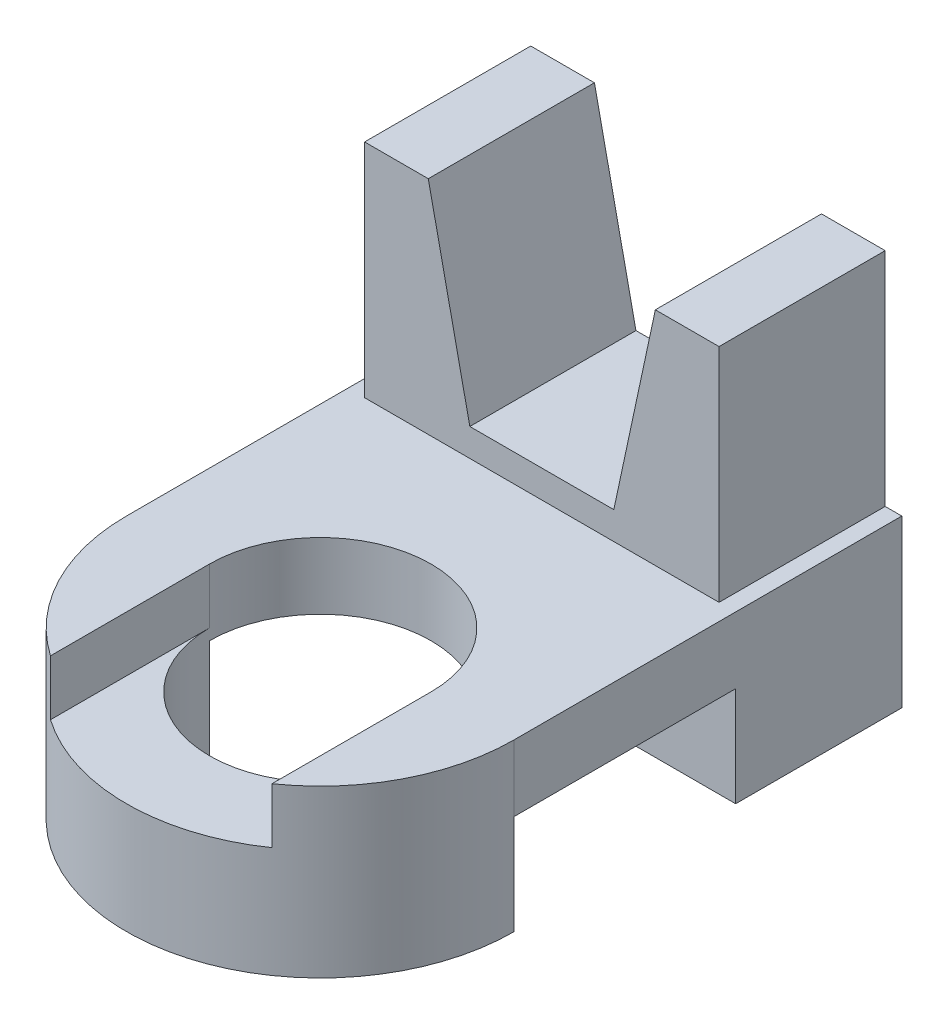
ISO-10303-21;
HEADER;
FILE_DESCRIPTION(('STEP AP214'),'2;1');
FILE_NAME('part.step','',(''),(''),'','','');
FILE_SCHEMA(('AUTOMOTIVE_DESIGN { 1 0 10303 214 1 1 1 1 }'));
ENDSEC;
DATA;
#1=APPLICATION_CONTEXT('core data for automotive mechanical design processes');
#2=APPLICATION_PROTOCOL_DEFINITION('international standard','automotive_design',2000,#1);
#3=PRODUCT_CONTEXT('',#1,'mechanical');
#4=PRODUCT('Part','Part','',(#3));
#5=PRODUCT_RELATED_PRODUCT_CATEGORY('part','',(#4));
#6=PRODUCT_DEFINITION_FORMATION('','',#4);
#7=PRODUCT_DEFINITION_CONTEXT('part definition',#1,'design');
#8=PRODUCT_DEFINITION('design','',#6,#7);
#9=PRODUCT_DEFINITION_SHAPE('','',#8);
#10=(LENGTH_UNIT() NAMED_UNIT(*) SI_UNIT(.MILLI.,.METRE.));
#11=(NAMED_UNIT(*) PLANE_ANGLE_UNIT() SI_UNIT($,.RADIAN.));
#12=(NAMED_UNIT(*) SI_UNIT($,.STERADIAN.) SOLID_ANGLE_UNIT());
#13=UNCERTAINTY_MEASURE_WITH_UNIT(LENGTH_MEASURE(1.E-05),#10,'distance_accuracy_value','');
#14=(GEOMETRIC_REPRESENTATION_CONTEXT(3) GLOBAL_UNCERTAINTY_ASSIGNED_CONTEXT((#13)) GLOBAL_UNIT_ASSIGNED_CONTEXT((#10,
#11,#12)) REPRESENTATION_CONTEXT('',''));
#15=CARTESIAN_POINT('',(0.,0.,0.));
#16=DIRECTION('',(0.,0.,1.));
#17=DIRECTION('',(1.,0.,0.));
#18=AXIS2_PLACEMENT_3D('',#15,#16,#17);
#19=CARTESIAN_POINT('',(0.,70.,0.));
#20=DIRECTION('',(0.,1.,0.));
#21=DIRECTION('',(0.,0.,1.));
#22=AXIS2_PLACEMENT_3D('',#19,#20,#21);
#23=PLANE('',#22);
#24=DIRECTION('',(0.,0.,1.));
#25=VECTOR('',#24,1.);
#26=CARTESIAN_POINT('',(20.5,70.,-35.));
#27=LINE('',#26,#25);
#28=CARTESIAN_POINT('',(20.5,70.,-35.));
#29=VERTEX_POINT('',#28);
#30=CARTESIAN_POINT('',(20.5,70.,-5.));
#31=VERTEX_POINT('',#30);
#32=EDGE_CURVE('E193',#29,#31,#27,.T.);
#33=ORIENTED_EDGE('',*,*,#32,.T.);
#34=DIRECTION('',(1.,0.,0.));
#35=VECTOR('',#34,1.);
#36=CARTESIAN_POINT('',(-32.,70.,-4.99999999999999));
#37=LINE('',#36,#35);
#38=CARTESIAN_POINT('',(32.,70.,-5.));
#39=VERTEX_POINT('',#38);
#40=EDGE_CURVE('E467',#31,#39,#37,.T.);
#41=ORIENTED_EDGE('',*,*,#40,.T.);
#42=DIRECTION('',(0.,0.,-1.));
#43=VECTOR('',#42,1.);
#44=CARTESIAN_POINT('',(32.,70.,-35.));
#45=LINE('',#44,#43);
#46=CARTESIAN_POINT('',(32.,70.,-35.));
#47=VERTEX_POINT('',#46);
#48=EDGE_CURVE('E217',#39,#47,#45,.T.);
#49=ORIENTED_EDGE('',*,*,#48,.T.);
#50=DIRECTION('',(-1.,0.,0.));
#51=VECTOR('',#50,1.);
#52=CARTESIAN_POINT('',(-32.,70.,-35.));
#53=LINE('',#52,#51);
#54=EDGE_CURVE('E211',#47,#29,#53,.T.);
#55=ORIENTED_EDGE('',*,*,#54,.T.);
#56=EDGE_LOOP('',(#33,#41,#49,#55));
#57=FACE_BOUND('',#56,.T.);
#58=ADVANCED_FACE('F49',(#57),#23,.T.);
#59=CARTESIAN_POINT('',(0.,0.,0.));
#60=DIRECTION('',(0.,1.,0.));
#61=DIRECTION('',(0.,0.,1.));
#62=AXIS2_PLACEMENT_3D('',#59,#60,#61);
#63=PLANE('',#62);
#64=CARTESIAN_POINT('',(0.,0.,35.));
#65=DIRECTION('',(0.,1.,0.));
#66=DIRECTION('',(0.,0.,1.));
#67=AXIS2_PLACEMENT_3D('',#64,#65,#66);
#68=CIRCLE('',#67,35.);
#69=CARTESIAN_POINT('',(-35.,0.,35.));
#70=VERTEX_POINT('',#69);
#71=CARTESIAN_POINT('',(35.,0.,35.));
#72=VERTEX_POINT('',#71);
#73=EDGE_CURVE('E357',#70,#72,#68,.T.);
#74=ORIENTED_EDGE('',*,*,#73,.F.);
#75=DIRECTION('',(1.,0.,0.));
#76=VECTOR('',#75,1.);
#77=CARTESIAN_POINT('',(-35.,0.,35.));
#78=LINE('',#77,#76);
#79=CARTESIAN_POINT('',(-20.,0.,35.));
#80=VERTEX_POINT('',#79);
#81=EDGE_CURVE('E296',#70,#80,#78,.T.);
#82=ORIENTED_EDGE('',*,*,#81,.T.);
#83=CARTESIAN_POINT('',(0.,0.,35.));
#84=DIRECTION('',(0.,1.,0.));
#85=DIRECTION('',(0.,0.,1.));
#86=AXIS2_PLACEMENT_3D('',#83,#84,#85);
#87=CIRCLE('',#86,20.);
#88=CARTESIAN_POINT('',(20.,0.,35.));
#89=VERTEX_POINT('',#88);
#90=EDGE_CURVE('E326',#80,#89,#87,.T.);
#91=ORIENTED_EDGE('',*,*,#90,.T.);
#92=DIRECTION('',(1.,0.,0.));
#93=VECTOR('',#92,1.);
#94=CARTESIAN_POINT('',(0.,0.,35.));
#95=LINE('',#94,#93);
#96=EDGE_CURVE('E382',#89,#72,#95,.T.);
#97=ORIENTED_EDGE('',*,*,#96,.T.);
#98=EDGE_LOOP('',(#74,#82,#91,#97));
#99=FACE_BOUND('',#98,.T.);
#100=ADVANCED_FACE('F427',(#99),#63,.F.);
#101=CARTESIAN_POINT('',(-35.,30.,0.));
#102=DIRECTION('',(-1.,0.,0.));
#103=DIRECTION('',(0.,0.,1.));
#104=AXIS2_PLACEMENT_3D('',#101,#102,#103);
#105=PLANE('',#104);
#106=DIRECTION('',(0.,0.,1.));
#107=VECTOR('',#106,1.);
#108=CARTESIAN_POINT('',(-35.,18.,35.));
#109=LINE('',#108,#107);
#110=CARTESIAN_POINT('',(-35.,18.,-4.99999999999998));
#111=VERTEX_POINT('',#110);
#112=CARTESIAN_POINT('',(-35.,18.,35.));
#113=VERTEX_POINT('',#112);
#114=EDGE_CURVE('E292',#111,#113,#109,.T.);
#115=ORIENTED_EDGE('',*,*,#114,.T.);
#116=DIRECTION('',(0.,-1.,0.));
#117=VECTOR('',#116,1.);
#118=CARTESIAN_POINT('',(-35.,30.,35.));
#119=LINE('',#118,#117);
#120=CARTESIAN_POINT('',(-35.,30.,35.));
#121=VERTEX_POINT('',#120);
#122=EDGE_CURVE('E378',#121,#113,#119,.T.);
#123=ORIENTED_EDGE('',*,*,#122,.F.);
#124=DIRECTION('',(0.,0.,-1.));
#125=VECTOR('',#124,1.);
#126=CARTESIAN_POINT('',(-35.,30.,0.));
#127=LINE('',#126,#125);
#128=CARTESIAN_POINT('',(-35.,30.,-35.));
#129=VERTEX_POINT('',#128);
#130=EDGE_CURVE('E331',#121,#129,#127,.T.);
#131=ORIENTED_EDGE('',*,*,#130,.T.);
#132=DIRECTION('',(0.,-1.,0.));
#133=VECTOR('',#132,1.);
#134=CARTESIAN_POINT('',(-35.,30.,-35.));
#135=LINE('',#134,#133);
#136=CARTESIAN_POINT('',(-35.,0.,-35.));
#137=VERTEX_POINT('',#136);
#138=EDGE_CURVE('E350',#129,#137,#135,.T.);
#139=ORIENTED_EDGE('',*,*,#138,.T.);
#140=DIRECTION('',(0.,0.,-1.));
#141=VECTOR('',#140,1.);
#142=CARTESIAN_POINT('',(-35.,0.,0.));
#143=LINE('',#142,#141);
#144=CARTESIAN_POINT('',(-35.,0.,-4.99999999999998));
#145=VERTEX_POINT('',#144);
#146=EDGE_CURVE('E354',#145,#137,#143,.T.);
#147=ORIENTED_EDGE('',*,*,#146,.F.);
#148=DIRECTION('',(0.,1.,0.));
#149=VECTOR('',#148,1.);
#150=CARTESIAN_POINT('',(-35.,0.,-4.99999999999998));
#151=LINE('',#150,#149);
#152=EDGE_CURVE('E287',#145,#111,#151,.T.);
#153=ORIENTED_EDGE('',*,*,#152,.T.);
#154=EDGE_LOOP('',(#115,#123,#131,#139,#147,#153));
#155=FACE_BOUND('',#154,.T.);
#156=ADVANCED_FACE('F435',(#155),#105,.T.);
#157=CARTESIAN_POINT('',(0.,30.,35.));
#158=DIRECTION('',(0.,-1.,0.));
#159=DIRECTION('',(0.,0.,-1.));
#160=AXIS2_PLACEMENT_3D('',#157,#158,#159);
#161=CYLINDRICAL_SURFACE('',#160,35.);
#162=CARTESIAN_POINT('',(0.,30.,35.));
#163=DIRECTION('',(0.,1.,0.));
#164=DIRECTION('',(0.,0.,1.));
#165=AXIS2_PLACEMENT_3D('',#162,#163,#164);
#166=CIRCLE('',#165,35.);
#167=CARTESIAN_POINT('',(20.,30.,63.7228132326902));
#168=VERTEX_POINT('',#167);
#169=CARTESIAN_POINT('',(35.,30.,35.));
#170=VERTEX_POINT('',#169);
#171=EDGE_CURVE('E336',#168,#170,#166,.T.);
#172=ORIENTED_EDGE('',*,*,#171,.F.);
#173=DIRECTION('',(0.,-1.,0.));
#174=VECTOR('',#173,1.);
#175=CARTESIAN_POINT('',(20.,30.,63.7228132326902));
#176=LINE('',#175,#174);
#177=CARTESIAN_POINT('',(20.,20.,63.7228132326902));
#178=VERTEX_POINT('',#177);
#179=EDGE_CURVE('E275',#168,#178,#176,.T.);
#180=ORIENTED_EDGE('',*,*,#179,.T.);
#181=CARTESIAN_POINT('',(0.,20.,35.));
#182=DIRECTION('',(0.,1.,0.));
#183=DIRECTION('',(0.,0.,1.));
#184=AXIS2_PLACEMENT_3D('',#181,#182,#183);
#185=CIRCLE('',#184,35.);
#186=CARTESIAN_POINT('',(-20.,20.,63.7228132326902));
#187=VERTEX_POINT('',#186);
#188=EDGE_CURVE('E279',#187,#178,#185,.T.);
#189=ORIENTED_EDGE('',*,*,#188,.F.);
#190=DIRECTION('',(0.,-1.,0.));
#191=VECTOR('',#190,1.);
#192=CARTESIAN_POINT('',(-20.,30.,63.7228132326902));
#193=LINE('',#192,#191);
#194=CARTESIAN_POINT('',(-20.,30.,63.7228132326902));
#195=VERTEX_POINT('',#194);
#196=EDGE_CURVE('E269',#187,#195,#193,.F.);
#197=ORIENTED_EDGE('',*,*,#196,.T.);
#198=EDGE_CURVE('E337',#121,#195,#166,.T.);
#199=ORIENTED_EDGE('',*,*,#198,.F.);
#200=ORIENTED_EDGE('',*,*,#122,.T.);
#201=DIRECTION('',(0.,-1.,0.));
#202=VECTOR('',#201,1.);
#203=CARTESIAN_POINT('',(-35.,0.,35.));
#204=LINE('',#203,#202);
#205=EDGE_CURVE('E283',#113,#70,#204,.T.);
#206=ORIENTED_EDGE('',*,*,#205,.T.);
#207=ORIENTED_EDGE('',*,*,#73,.T.);
#208=DIRECTION('',(0.,-1.,0.));
#209=VECTOR('',#208,1.);
#210=CARTESIAN_POINT('',(35.,0.,35.));
#211=LINE('',#210,#209);
#212=CARTESIAN_POINT('',(35.,18.,35.));
#213=VERTEX_POINT('',#212);
#214=EDGE_CURVE('E282',#213,#72,#211,.T.);
#215=ORIENTED_EDGE('',*,*,#214,.F.);
#216=DIRECTION('',(0.,-1.,0.));
#217=VECTOR('',#216,1.);
#218=CARTESIAN_POINT('',(35.,30.,35.));
#219=LINE('',#218,#217);
#220=EDGE_CURVE('E374',#170,#213,#219,.T.);
#221=ORIENTED_EDGE('',*,*,#220,.F.);
#222=EDGE_LOOP('',(#172,#180,#189,#197,#199,#200,#206,#207,#215,#221));
#223=FACE_BOUND('',#222,.T.);
#224=ADVANCED_FACE('F410',(#223),#161,.T.);
#225=CARTESIAN_POINT('',(35.,30.,0.));
#226=DIRECTION('',(-1.,0.,0.));
#227=DIRECTION('',(0.,0.,1.));
#228=AXIS2_PLACEMENT_3D('',#225,#226,#227);
#229=PLANE('',#228);
#230=ORIENTED_EDGE('',*,*,#220,.T.);
#231=DIRECTION('',(0.,0.,1.));
#232=VECTOR('',#231,1.);
#233=CARTESIAN_POINT('',(35.,18.,35.));
#234=LINE('',#233,#232);
#235=CARTESIAN_POINT('',(35.,18.,-4.99999999999999));
#236=VERTEX_POINT('',#235);
#237=EDGE_CURVE('E288',#236,#213,#234,.T.);
#238=ORIENTED_EDGE('',*,*,#237,.F.);
#239=DIRECTION('',(0.,1.,0.));
#240=VECTOR('',#239,1.);
#241=CARTESIAN_POINT('',(35.,0.,-4.99999999999999));
#242=LINE('',#241,#240);
#243=CARTESIAN_POINT('',(35.,0.,-4.99999999999999));
#244=VERTEX_POINT('',#243);
#245=EDGE_CURVE('E299',#244,#236,#242,.T.);
#246=ORIENTED_EDGE('',*,*,#245,.F.);
#247=DIRECTION('',(0.,0.,-1.));
#248=VECTOR('',#247,1.);
#249=CARTESIAN_POINT('',(35.,0.,0.));
#250=LINE('',#249,#248);
#251=CARTESIAN_POINT('',(35.,0.,-35.));
#252=VERTEX_POINT('',#251);
#253=EDGE_CURVE('E361',#244,#252,#250,.T.);
#254=ORIENTED_EDGE('',*,*,#253,.T.);
#255=DIRECTION('',(0.,-1.,0.));
#256=VECTOR('',#255,1.);
#257=CARTESIAN_POINT('',(35.,30.,-35.));
#258=LINE('',#257,#256);
#259=CARTESIAN_POINT('',(35.,30.,-35.));
#260=VERTEX_POINT('',#259);
#261=EDGE_CURVE('E370',#260,#252,#258,.T.);
#262=ORIENTED_EDGE('',*,*,#261,.F.);
#263=DIRECTION('',(0.,0.,-1.));
#264=VECTOR('',#263,1.);
#265=CARTESIAN_POINT('',(35.,30.,0.));
#266=LINE('',#265,#264);
#267=EDGE_CURVE('E341',#170,#260,#266,.T.);
#268=ORIENTED_EDGE('',*,*,#267,.F.);
#269=EDGE_LOOP('',(#230,#238,#246,#254,#262,#268));
#270=FACE_BOUND('',#269,.T.);
#271=ADVANCED_FACE('F576',(#270),#229,.F.);
#272=CARTESIAN_POINT('',(0.,30.,35.));
#273=DIRECTION('',(0.,-1.,0.));
#274=DIRECTION('',(0.,0.,-1.));
#275=AXIS2_PLACEMENT_3D('',#272,#273,#274);
#276=CYLINDRICAL_SURFACE('',#275,20.);
#277=DIRECTION('',(0.,1.,0.));
#278=VECTOR('',#277,1.);
#279=CARTESIAN_POINT('',(20.,20.,35.));
#280=LINE('',#279,#278);
#281=CARTESIAN_POINT('',(20.,20.,35.));
#282=VERTEX_POINT('',#281);
#283=CARTESIAN_POINT('',(20.,30.,35.));
#284=VERTEX_POINT('',#283);
#285=EDGE_CURVE('E265',#282,#284,#280,.T.);
#286=ORIENTED_EDGE('',*,*,#285,.T.);
#287=CARTESIAN_POINT('',(0.,30.,35.));
#288=DIRECTION('',(0.,1.,0.));
#289=DIRECTION('',(0.,0.,1.));
#290=AXIS2_PLACEMENT_3D('',#287,#288,#289);
#291=CIRCLE('',#290,20.);
#292=CARTESIAN_POINT('',(-20.,30.,35.));
#293=VERTEX_POINT('',#292);
#294=EDGE_CURVE('E327',#284,#293,#291,.T.);
#295=ORIENTED_EDGE('',*,*,#294,.T.);
#296=DIRECTION('',(0.,1.,0.));
#297=VECTOR('',#296,1.);
#298=CARTESIAN_POINT('',(-20.,20.,35.));
#299=LINE('',#298,#297);
#300=CARTESIAN_POINT('',(-20.,20.,35.));
#301=VERTEX_POINT('',#300);
#302=EDGE_CURVE('E262',#301,#293,#299,.T.);
#303=ORIENTED_EDGE('',*,*,#302,.F.);
#304=CARTESIAN_POINT('',(0.,20.,35.));
#305=DIRECTION('',(0.,1.,0.));
#306=DIRECTION('',(0.,0.,1.));
#307=AXIS2_PLACEMENT_3D('',#304,#305,#306);
#308=CIRCLE('',#307,20.);
#309=EDGE_CURVE('E11',#301,#282,#308,.T.);
#310=ORIENTED_EDGE('',*,*,#309,.T.);
#311=EDGE_LOOP('',(#286,#295,#303,#310));
#312=FACE_BOUND('',#311,.T.);
#313=DIRECTION('',(0.,-1.,0.));
#314=VECTOR('',#313,1.);
#315=CARTESIAN_POINT('',(-20.,30.,35.));
#316=LINE('',#315,#314);
#317=CARTESIAN_POINT('',(-20.,18.,35.));
#318=VERTEX_POINT('',#317);
#319=EDGE_CURVE('E323',#318,#80,#316,.T.);
#320=ORIENTED_EDGE('',*,*,#319,.F.);
#321=CARTESIAN_POINT('',(0.,18.,35.));
#322=DIRECTION('',(0.,1.,0.));
#323=DIRECTION('',(0.,0.,1.));
#324=AXIS2_PLACEMENT_3D('',#321,#322,#323);
#325=CIRCLE('',#324,20.);
#326=CARTESIAN_POINT('',(20.,18.,35.));
#327=VERTEX_POINT('',#326);
#328=EDGE_CURVE('E386',#327,#318,#325,.T.);
#329=ORIENTED_EDGE('',*,*,#328,.F.);
#330=DIRECTION('',(0.,-1.,0.));
#331=VECTOR('',#330,1.);
#332=CARTESIAN_POINT('',(20.,30.,35.));
#333=LINE('',#332,#331);
#334=EDGE_CURVE('E310',#89,#327,#333,.F.);
#335=ORIENTED_EDGE('',*,*,#334,.F.);
#336=ORIENTED_EDGE('',*,*,#90,.F.);
#337=EDGE_LOOP('',(#320,#329,#335,#336));
#338=FACE_BOUND('',#337,.T.);
#339=ADVANCED_FACE('F51',(#312,#338),#276,.F.);
#340=CARTESIAN_POINT('',(0.,30.,-35.));
#341=DIRECTION('',(0.,0.,-1.));
#342=DIRECTION('',(-1.,0.,0.));
#343=AXIS2_PLACEMENT_3D('',#340,#341,#342);
#344=PLANE('',#343);
#345=DIRECTION('',(0.209529088730873,0.97780241407741,0.));
#346=VECTOR('',#345,1.);
#347=CARTESIAN_POINT('',(13.,35.,-35.));
#348=LINE('',#347,#346);
#349=CARTESIAN_POINT('',(13.,35.,-35.));
#350=VERTEX_POINT('',#349);
#351=EDGE_CURVE('E196',#350,#29,#348,.T.);
#352=ORIENTED_EDGE('',*,*,#351,.T.);
#353=ORIENTED_EDGE('',*,*,#54,.F.);
#354=DIRECTION('',(0.,-1.,0.));
#355=VECTOR('',#354,1.);
#356=CARTESIAN_POINT('',(32.,70.,-35.));
#357=LINE('',#356,#355);
#358=CARTESIAN_POINT('',(32.,30.,-35.));
#359=VERTEX_POINT('',#358);
#360=EDGE_CURVE('E228',#47,#359,#357,.T.);
#361=ORIENTED_EDGE('',*,*,#360,.T.);
#362=DIRECTION('',(1.,0.,0.));
#363=VECTOR('',#362,1.);
#364=CARTESIAN_POINT('',(0.,30.,-35.));
#365=LINE('',#364,#363);
#366=EDGE_CURVE('E345',#359,#260,#365,.T.);
#367=ORIENTED_EDGE('',*,*,#366,.T.);
#368=ORIENTED_EDGE('',*,*,#261,.T.);
#369=DIRECTION('',(1.,0.,0.));
#370=VECTOR('',#369,1.);
#371=CARTESIAN_POINT('',(0.,0.,-35.));
#372=LINE('',#371,#370);
#373=EDGE_CURVE('E332',#137,#252,#372,.T.);
#374=ORIENTED_EDGE('',*,*,#373,.F.);
#375=ORIENTED_EDGE('',*,*,#138,.F.);
#376=CARTESIAN_POINT('',(-32.,30.,-35.));
#377=VERTEX_POINT('',#376);
#378=EDGE_CURVE('E346',#129,#377,#365,.T.);
#379=ORIENTED_EDGE('',*,*,#378,.T.);
#380=DIRECTION('',(0.,-1.,0.));
#381=VECTOR('',#380,1.);
#382=CARTESIAN_POINT('',(-32.,70.,-35.));
#383=LINE('',#382,#381);
#384=CARTESIAN_POINT('',(-32.,70.,-35.));
#385=VERTEX_POINT('',#384);
#386=EDGE_CURVE('E220',#385,#377,#383,.T.);
#387=ORIENTED_EDGE('',*,*,#386,.F.);
#388=CARTESIAN_POINT('',(-20.5,70.,-35.));
#389=VERTEX_POINT('',#388);
#390=EDGE_CURVE('E221',#389,#385,#53,.T.);
#391=ORIENTED_EDGE('',*,*,#390,.F.);
#392=DIRECTION('',(0.209529088730874,-0.97780241407741,0.));
#393=VECTOR('',#392,1.);
#394=CARTESIAN_POINT('',(-13.,35.,-35.));
#395=LINE('',#394,#393);
#396=CARTESIAN_POINT('',(-13.,35.,-35.));
#397=VERTEX_POINT('',#396);
#398=EDGE_CURVE('E65',#389,#397,#395,.T.);
#399=ORIENTED_EDGE('',*,*,#398,.T.);
#400=DIRECTION('',(1.,0.,0.));
#401=VECTOR('',#400,1.);
#402=CARTESIAN_POINT('',(-13.,35.,-35.));
#403=LINE('',#402,#401);
#404=EDGE_CURVE('E205',#397,#350,#403,.T.);
#405=ORIENTED_EDGE('',*,*,#404,.T.);
#406=EDGE_LOOP('',(#352,#353,#361,#367,#368,#374,#375,#379,#387,#391,#399,#405));
#407=FACE_BOUND('',#406,.T.);
#408=ADVANCED_FACE('F209',(#407),#344,.T.);
#409=CARTESIAN_POINT('',(0.,30.,0.));
#410=DIRECTION('',(0.,1.,0.));
#411=DIRECTION('',(0.,0.,1.));
#412=AXIS2_PLACEMENT_3D('',#409,#410,#411);
#413=PLANE('',#412);
#414=DIRECTION('',(0.,0.,1.));
#415=VECTOR('',#414,1.);
#416=CARTESIAN_POINT('',(-32.,30.,-35.));
#417=LINE('',#416,#415);
#418=CARTESIAN_POINT('',(-32.,30.,-4.99999999999999));
#419=VERTEX_POINT('',#418);
#420=EDGE_CURVE('E233',#377,#419,#417,.T.);
#421=ORIENTED_EDGE('',*,*,#420,.F.);
#422=ORIENTED_EDGE('',*,*,#378,.F.);
#423=ORIENTED_EDGE('',*,*,#130,.F.);
#424=ORIENTED_EDGE('',*,*,#198,.T.);
#425=DIRECTION('',(0.,0.,1.));
#426=VECTOR('',#425,1.);
#427=CARTESIAN_POINT('',(-20.,30.,35.));
#428=LINE('',#427,#426);
#429=EDGE_CURVE('E254',#293,#195,#428,.T.);
#430=ORIENTED_EDGE('',*,*,#429,.F.);
#431=ORIENTED_EDGE('',*,*,#294,.F.);
#432=DIRECTION('',(0.,0.,-1.));
#433=VECTOR('',#432,1.);
#434=CARTESIAN_POINT('',(20.,30.,0.));
#435=LINE('',#434,#433);
#436=EDGE_CURVE('E58',#168,#284,#435,.T.);
#437=ORIENTED_EDGE('',*,*,#436,.F.);
#438=ORIENTED_EDGE('',*,*,#171,.T.);
#439=ORIENTED_EDGE('',*,*,#267,.T.);
#440=ORIENTED_EDGE('',*,*,#366,.F.);
#441=DIRECTION('',(0.,0.,-1.));
#442=VECTOR('',#441,1.);
#443=CARTESIAN_POINT('',(32.,30.,-35.));
#444=LINE('',#443,#442);
#445=CARTESIAN_POINT('',(32.,30.,-5.));
#446=VERTEX_POINT('',#445);
#447=EDGE_CURVE('E240',#446,#359,#444,.T.);
#448=ORIENTED_EDGE('',*,*,#447,.F.);
#449=DIRECTION('',(1.,0.,0.));
#450=VECTOR('',#449,1.);
#451=CARTESIAN_POINT('',(-32.,30.,-4.99999999999999));
#452=LINE('',#451,#450);
#453=EDGE_CURVE('E73',#419,#446,#452,.T.);
#454=ORIENTED_EDGE('',*,*,#453,.F.);
#455=EDGE_LOOP('',(#421,#422,#423,#424,#430,#431,#437,#438,#439,#440,#448,#454));
#456=FACE_BOUND('',#455,.T.);
#457=ADVANCED_FACE('F402',(#456),#413,.T.);
#458=ORIENTED_EDGE('',*,*,#253,.F.);
#459=DIRECTION('',(1.,0.,0.));
#460=VECTOR('',#459,1.);
#461=CARTESIAN_POINT('',(-35.,0.,-4.99999999999998));
#462=LINE('',#461,#460);
#463=EDGE_CURVE('E315',#145,#244,#462,.T.);
#464=ORIENTED_EDGE('',*,*,#463,.F.);
#465=ORIENTED_EDGE('',*,*,#146,.T.);
#466=ORIENTED_EDGE('',*,*,#373,.T.);
#467=EDGE_LOOP('',(#458,#464,#465,#466));
#468=FACE_BOUND('',#467,.T.);
#469=ADVANCED_FACE('F438',(#468),#63,.F.);
#470=CARTESIAN_POINT('',(-35.,0.,35.));
#471=DIRECTION('',(0.,0.,1.));
#472=DIRECTION('',(1.,0.,0.));
#473=AXIS2_PLACEMENT_3D('',#470,#471,#472);
#474=PLANE('',#473);
#475=ORIENTED_EDGE('',*,*,#319,.T.);
#476=ORIENTED_EDGE('',*,*,#81,.F.);
#477=ORIENTED_EDGE('',*,*,#205,.F.);
#478=DIRECTION('',(1.,0.,0.));
#479=VECTOR('',#478,1.);
#480=CARTESIAN_POINT('',(-35.,18.,35.));
#481=LINE('',#480,#479);
#482=EDGE_CURVE('E306',#113,#318,#481,.T.);
#483=ORIENTED_EDGE('',*,*,#482,.T.);
#484=EDGE_LOOP('',(#475,#476,#477,#483));
#485=FACE_BOUND('',#484,.T.);
#486=ADVANCED_FACE('F597',(#485),#474,.F.);
#487=ORIENTED_EDGE('',*,*,#334,.T.);
#488=EDGE_CURVE('E311',#327,#213,#481,.T.);
#489=ORIENTED_EDGE('',*,*,#488,.T.);
#490=ORIENTED_EDGE('',*,*,#214,.T.);
#491=ORIENTED_EDGE('',*,*,#96,.F.);
#492=EDGE_LOOP('',(#487,#489,#490,#491));
#493=FACE_BOUND('',#492,.T.);
#494=ADVANCED_FACE('F592',(#493),#474,.F.);
#495=CARTESIAN_POINT('',(-35.,18.,35.));
#496=DIRECTION('',(0.,1.,0.));
#497=DIRECTION('',(0.,0.,1.));
#498=AXIS2_PLACEMENT_3D('',#495,#496,#497);
#499=PLANE('',#498);
#500=ORIENTED_EDGE('',*,*,#328,.T.);
#501=ORIENTED_EDGE('',*,*,#482,.F.);
#502=ORIENTED_EDGE('',*,*,#114,.F.);
#503=DIRECTION('',(1.,0.,0.));
#504=VECTOR('',#503,1.);
#505=CARTESIAN_POINT('',(-35.,18.,-4.99999999999998));
#506=LINE('',#505,#504);
#507=EDGE_CURVE('E312',#111,#236,#506,.T.);
#508=ORIENTED_EDGE('',*,*,#507,.T.);
#509=ORIENTED_EDGE('',*,*,#237,.T.);
#510=ORIENTED_EDGE('',*,*,#488,.F.);
#511=EDGE_LOOP('',(#500,#501,#502,#508,#509,#510));
#512=FACE_BOUND('',#511,.T.);
#513=ADVANCED_FACE('F422',(#512),#499,.F.);
#514=CARTESIAN_POINT('',(-35.,0.,-4.99999999999998));
#515=DIRECTION('',(0.,0.,-1.));
#516=DIRECTION('',(-1.,0.,0.));
#517=AXIS2_PLACEMENT_3D('',#514,#515,#516);
#518=PLANE('',#517);
#519=ORIENTED_EDGE('',*,*,#245,.T.);
#520=ORIENTED_EDGE('',*,*,#507,.F.);
#521=ORIENTED_EDGE('',*,*,#152,.F.);
#522=ORIENTED_EDGE('',*,*,#463,.T.);
#523=EDGE_LOOP('',(#519,#520,#521,#522));
#524=FACE_BOUND('',#523,.T.);
#525=ADVANCED_FACE('F414',(#524),#518,.F.);
#526=CARTESIAN_POINT('',(0.,20.,35.));
#527=DIRECTION('',(0.,1.,0.));
#528=DIRECTION('',(0.,0.,1.));
#529=AXIS2_PLACEMENT_3D('',#526,#527,#528);
#530=PLANE('',#529);
#531=ORIENTED_EDGE('',*,*,#188,.T.);
#532=DIRECTION('',(0.,0.,-1.));
#533=VECTOR('',#532,1.);
#534=CARTESIAN_POINT('',(20.,20.,35.));
#535=LINE('',#534,#533);
#536=EDGE_CURVE('E259',#178,#282,#535,.T.);
#537=ORIENTED_EDGE('',*,*,#536,.T.);
#538=ORIENTED_EDGE('',*,*,#309,.F.);
#539=DIRECTION('',(0.,0.,1.));
#540=VECTOR('',#539,1.);
#541=CARTESIAN_POINT('',(-20.,20.,35.));
#542=LINE('',#541,#540);
#543=EDGE_CURVE('E255',#301,#187,#542,.T.);
#544=ORIENTED_EDGE('',*,*,#543,.T.);
#545=EDGE_LOOP('',(#531,#537,#538,#544));
#546=FACE_BOUND('',#545,.T.);
#547=ADVANCED_FACE('F412',(#546),#530,.T.);
#548=CARTESIAN_POINT('',(20.,20.,35.));
#549=DIRECTION('',(1.,0.,0.));
#550=DIRECTION('',(0.,0.,-1.));
#551=AXIS2_PLACEMENT_3D('',#548,#549,#550);
#552=PLANE('',#551);
#553=ORIENTED_EDGE('',*,*,#436,.T.);
#554=ORIENTED_EDGE('',*,*,#285,.F.);
#555=ORIENTED_EDGE('',*,*,#536,.F.);
#556=ORIENTED_EDGE('',*,*,#179,.F.);
#557=EDGE_LOOP('',(#553,#554,#555,#556));
#558=FACE_BOUND('',#557,.T.);
#559=ADVANCED_FACE('F394',(#558),#552,.F.);
#560=CARTESIAN_POINT('',(-20.,20.,35.));
#561=DIRECTION('',(-1.,0.,0.));
#562=DIRECTION('',(0.,0.,1.));
#563=AXIS2_PLACEMENT_3D('',#560,#561,#562);
#564=PLANE('',#563);
#565=ORIENTED_EDGE('',*,*,#543,.F.);
#566=ORIENTED_EDGE('',*,*,#302,.T.);
#567=ORIENTED_EDGE('',*,*,#429,.T.);
#568=ORIENTED_EDGE('',*,*,#196,.F.);
#569=EDGE_LOOP('',(#565,#566,#567,#568));
#570=FACE_BOUND('',#569,.T.);
#571=ADVANCED_FACE('F407',(#570),#564,.F.);
#572=CARTESIAN_POINT('',(-32.,70.,-35.));
#573=DIRECTION('',(1.,0.,0.));
#574=DIRECTION('',(0.,0.,-1.));
#575=AXIS2_PLACEMENT_3D('',#572,#573,#574);
#576=PLANE('',#575);
#577=ORIENTED_EDGE('',*,*,#420,.T.);
#578=DIRECTION('',(0.,-1.,0.));
#579=VECTOR('',#578,1.);
#580=CARTESIAN_POINT('',(-32.,70.,-4.99999999999999));
#581=LINE('',#580,#579);
#582=CARTESIAN_POINT('',(-32.,70.,-4.99999999999999));
#583=VERTEX_POINT('',#582);
#584=EDGE_CURVE('E251',#583,#419,#581,.T.);
#585=ORIENTED_EDGE('',*,*,#584,.F.);
#586=DIRECTION('',(0.,0.,1.));
#587=VECTOR('',#586,1.);
#588=CARTESIAN_POINT('',(-32.,70.,-35.));
#589=LINE('',#588,#587);
#590=EDGE_CURVE('E243',#385,#583,#589,.T.);
#591=ORIENTED_EDGE('',*,*,#590,.F.);
#592=ORIENTED_EDGE('',*,*,#386,.T.);
#593=EDGE_LOOP('',(#577,#585,#591,#592));
#594=FACE_BOUND('',#593,.T.);
#595=ADVANCED_FACE('F465',(#594),#576,.F.);
#596=CARTESIAN_POINT('',(-32.,70.,-4.99999999999999));
#597=DIRECTION('',(0.,0.,-1.));
#598=DIRECTION('',(-1.,0.,0.));
#599=AXIS2_PLACEMENT_3D('',#596,#597,#598);
#600=PLANE('',#599);
#601=ORIENTED_EDGE('',*,*,#40,.F.);
#602=DIRECTION('',(0.209529088730873,0.97780241407741,0.));
#603=VECTOR('',#602,1.);
#604=CARTESIAN_POINT('',(13.,35.,-5.));
#605=LINE('',#604,#603);
#606=CARTESIAN_POINT('',(13.,35.,-5.));
#607=VERTEX_POINT('',#606);
#608=EDGE_CURVE('E199',#607,#31,#605,.T.);
#609=ORIENTED_EDGE('',*,*,#608,.F.);
#610=DIRECTION('',(1.,0.,0.));
#611=VECTOR('',#610,1.);
#612=CARTESIAN_POINT('',(-13.,35.,-5.));
#613=LINE('',#612,#611);
#614=CARTESIAN_POINT('',(-13.,35.,-5.));
#615=VERTEX_POINT('',#614);
#616=EDGE_CURVE('E214',#615,#607,#613,.T.);
#617=ORIENTED_EDGE('',*,*,#616,.F.);
#618=DIRECTION('',(0.209529088730874,-0.97780241407741,0.));
#619=VECTOR('',#618,1.);
#620=CARTESIAN_POINT('',(-13.,35.,-5.));
#621=LINE('',#620,#619);
#622=CARTESIAN_POINT('',(-20.5,70.,-5.));
#623=VERTEX_POINT('',#622);
#624=EDGE_CURVE('E746',#623,#615,#621,.T.);
#625=ORIENTED_EDGE('',*,*,#624,.F.);
#626=EDGE_CURVE('E455',#583,#623,#37,.T.);
#627=ORIENTED_EDGE('',*,*,#626,.F.);
#628=ORIENTED_EDGE('',*,*,#584,.T.);
#629=ORIENTED_EDGE('',*,*,#453,.T.);
#630=DIRECTION('',(0.,-1.,0.));
#631=VECTOR('',#630,1.);
#632=CARTESIAN_POINT('',(32.,70.,-5.));
#633=LINE('',#632,#631);
#634=EDGE_CURVE('E247',#39,#446,#633,.T.);
#635=ORIENTED_EDGE('',*,*,#634,.F.);
#636=EDGE_LOOP('',(#601,#609,#617,#625,#627,#628,#629,#635));
#637=FACE_BOUND('',#636,.T.);
#638=ADVANCED_FACE('F449',(#637),#600,.F.);
#639=CARTESIAN_POINT('',(32.,70.,-35.));
#640=DIRECTION('',(-1.,0.,0.));
#641=DIRECTION('',(0.,0.,1.));
#642=AXIS2_PLACEMENT_3D('',#639,#640,#641);
#643=PLANE('',#642);
#644=ORIENTED_EDGE('',*,*,#447,.T.);
#645=ORIENTED_EDGE('',*,*,#360,.F.);
#646=ORIENTED_EDGE('',*,*,#48,.F.);
#647=ORIENTED_EDGE('',*,*,#634,.T.);
#648=EDGE_LOOP('',(#644,#645,#646,#647));
#649=FACE_BOUND('',#648,.T.);
#650=ADVANCED_FACE('F442',(#649),#643,.F.);
#651=DIRECTION('',(0.,0.,1.));
#652=VECTOR('',#651,1.);
#653=CARTESIAN_POINT('',(-20.5,70.,-35.));
#654=LINE('',#653,#652);
#655=EDGE_CURVE('E204',#389,#623,#654,.T.);
#656=ORIENTED_EDGE('',*,*,#655,.F.);
#657=ORIENTED_EDGE('',*,*,#390,.T.);
#658=ORIENTED_EDGE('',*,*,#590,.T.);
#659=ORIENTED_EDGE('',*,*,#626,.T.);
#660=EDGE_LOOP('',(#656,#657,#658,#659));
#661=FACE_BOUND('',#660,.T.);
#662=ADVANCED_FACE('F429',(#661),#23,.T.);
#663=CARTESIAN_POINT('',(13.,35.,-35.));
#664=DIRECTION('',(0.97780241407741,-0.209529088730873,0.));
#665=DIRECTION('',(0.209529088730873,0.97780241407741,0.));
#666=AXIS2_PLACEMENT_3D('',#663,#664,#665);
#667=PLANE('',#666);
#668=ORIENTED_EDGE('',*,*,#608,.T.);
#669=ORIENTED_EDGE('',*,*,#32,.F.);
#670=ORIENTED_EDGE('',*,*,#351,.F.);
#671=DIRECTION('',(0.,0.,1.));
#672=VECTOR('',#671,1.);
#673=CARTESIAN_POINT('',(13.,35.,-35.));
#674=LINE('',#673,#672);
#675=EDGE_CURVE('E237',#350,#607,#674,.T.);
#676=ORIENTED_EDGE('',*,*,#675,.T.);
#677=EDGE_LOOP('',(#668,#669,#670,#676));
#678=FACE_BOUND('',#677,.T.);
#679=ADVANCED_FACE('F195',(#678),#667,.F.);
#680=CARTESIAN_POINT('',(-13.,35.,-35.));
#681=DIRECTION('',(0.,-1.,0.));
#682=DIRECTION('',(1.,0.,0.));
#683=AXIS2_PLACEMENT_3D('',#680,#681,#682);
#684=PLANE('',#683);
#685=ORIENTED_EDGE('',*,*,#616,.T.);
#686=ORIENTED_EDGE('',*,*,#675,.F.);
#687=ORIENTED_EDGE('',*,*,#404,.F.);
#688=DIRECTION('',(0.,0.,1.));
#689=VECTOR('',#688,1.);
#690=CARTESIAN_POINT('',(-13.,35.,-35.));
#691=LINE('',#690,#689);
#692=EDGE_CURVE('E459',#397,#615,#691,.T.);
#693=ORIENTED_EDGE('',*,*,#692,.T.);
#694=EDGE_LOOP('',(#685,#686,#687,#693));
#695=FACE_BOUND('',#694,.T.);
#696=ADVANCED_FACE('F448',(#695),#684,.F.);
#697=CARTESIAN_POINT('',(-13.,35.,-35.));
#698=DIRECTION('',(-0.97780241407741,-0.209529088730874,0.));
#699=DIRECTION('',(0.209529088730874,-0.97780241407741,0.));
#700=AXIS2_PLACEMENT_3D('',#697,#698,#699);
#701=PLANE('',#700);
#702=ORIENTED_EDGE('',*,*,#624,.T.);
#703=ORIENTED_EDGE('',*,*,#692,.F.);
#704=ORIENTED_EDGE('',*,*,#398,.F.);
#705=ORIENTED_EDGE('',*,*,#655,.T.);
#706=EDGE_LOOP('',(#702,#703,#704,#705));
#707=FACE_BOUND('',#706,.T.);
#708=ADVANCED_FACE('F734',(#707),#701,.F.);
#709=CLOSED_SHELL('',(#58,#100,#156,#224,#271,#339,#408,#457,#469,#486,#494,#513,#525,#547,#559,
#571,#595,#638,#650,#662,#679,#696,#708));
#710=MANIFOLD_SOLID_BREP('B2',#709);
#711=ADVANCED_BREP_SHAPE_REPRESENTATION('',(#18,#710),#14);
#712=SHAPE_DEFINITION_REPRESENTATION(#9,#711);
ENDSEC;
END-ISO-10303-21;
